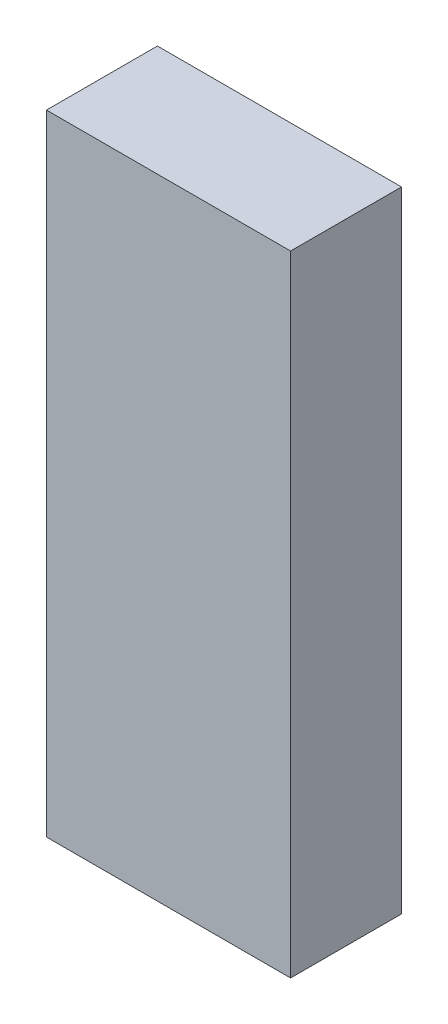
ISO-10303-21;
HEADER;
FILE_DESCRIPTION(('STEP AP214'),'2;1');
FILE_NAME('part.step','',(''),(''),'','','');
FILE_SCHEMA(('AUTOMOTIVE_DESIGN { 1 0 10303 214 1 1 1 1 }'));
ENDSEC;
DATA;
#1=APPLICATION_CONTEXT('core data for automotive mechanical design processes');
#2=APPLICATION_PROTOCOL_DEFINITION('international standard','automotive_design',2000,#1);
#3=PRODUCT_CONTEXT('',#1,'mechanical');
#4=PRODUCT('Part','Part','',(#3));
#5=PRODUCT_RELATED_PRODUCT_CATEGORY('part','',(#4));
#6=PRODUCT_DEFINITION_FORMATION('','',#4);
#7=PRODUCT_DEFINITION_CONTEXT('part definition',#1,'design');
#8=PRODUCT_DEFINITION('design','',#6,#7);
#9=PRODUCT_DEFINITION_SHAPE('','',#8);
#10=(LENGTH_UNIT() NAMED_UNIT(*) SI_UNIT(.MILLI.,.METRE.));
#11=(NAMED_UNIT(*) PLANE_ANGLE_UNIT() SI_UNIT($,.RADIAN.));
#12=(NAMED_UNIT(*) SI_UNIT($,.STERADIAN.) SOLID_ANGLE_UNIT());
#13=UNCERTAINTY_MEASURE_WITH_UNIT(LENGTH_MEASURE(1.E-05),#10,'distance_accuracy_value','');
#14=(GEOMETRIC_REPRESENTATION_CONTEXT(3) GLOBAL_UNCERTAINTY_ASSIGNED_CONTEXT((#13)) GLOBAL_UNIT_ASSIGNED_CONTEXT((#10,
#11,#12)) REPRESENTATION_CONTEXT('',''));
#15=CARTESIAN_POINT('',(0.,0.,0.));
#16=DIRECTION('',(0.,0.,1.));
#17=DIRECTION('',(1.,0.,0.));
#18=AXIS2_PLACEMENT_3D('',#15,#16,#17);
#19=CARTESIAN_POINT('',(-1.92499996,4.96499896,1.75));
#20=DIRECTION('',(0.,0.,1.));
#21=DIRECTION('',(1.,0.,0.));
#22=AXIS2_PLACEMENT_3D('',#19,#20,#21);
#23=PLANE('',#22);
#24=DIRECTION('',(0.,1.,0.));
#25=VECTOR('',#24,1.);
#26=CARTESIAN_POINT('',(1.92499996,4.96499896,1.75));
#27=LINE('',#26,#25);
#28=CARTESIAN_POINT('',(1.92499996,4.96499896,1.75));
#29=VERTEX_POINT('',#28);
#30=CARTESIAN_POINT('',(1.92499996,-4.96499896,1.75));
#31=VERTEX_POINT('',#30);
#32=EDGE_CURVE('E53',#29,#31,#27,.F.);
#33=ORIENTED_EDGE('',*,*,#32,.F.);
#34=DIRECTION('',(1.,0.,0.));
#35=VECTOR('',#34,1.);
#36=CARTESIAN_POINT('',(-1.92499996,4.96499896,1.75));
#37=LINE('',#36,#35);
#38=CARTESIAN_POINT('',(-1.92499996,4.96499896,1.75));
#39=VERTEX_POINT('',#38);
#40=EDGE_CURVE('E68',#39,#29,#37,.T.);
#41=ORIENTED_EDGE('',*,*,#40,.F.);
#42=DIRECTION('',(0.,1.,0.));
#43=VECTOR('',#42,1.);
#44=CARTESIAN_POINT('',(-1.92499996,-4.96499896,1.75));
#45=LINE('',#44,#43);
#46=CARTESIAN_POINT('',(-1.92499996,-4.96499896,1.75));
#47=VERTEX_POINT('',#46);
#48=EDGE_CURVE('E20',#47,#39,#45,.T.);
#49=ORIENTED_EDGE('',*,*,#48,.F.);
#50=DIRECTION('',(1.,0.,0.));
#51=VECTOR('',#50,1.);
#52=CARTESIAN_POINT('',(1.92499996,-4.96499896,1.75));
#53=LINE('',#52,#51);
#54=EDGE_CURVE('E58',#31,#47,#53,.F.);
#55=ORIENTED_EDGE('',*,*,#54,.F.);
#56=EDGE_LOOP('',(#33,#41,#49,#55));
#57=FACE_BOUND('',#56,.T.);
#58=ADVANCED_FACE('F17',(#57),#23,.T.);
#59=CARTESIAN_POINT('',(-1.92499996,-4.96499896,0.));
#60=DIRECTION('',(-1.,0.,0.));
#61=DIRECTION('',(0.,0.,1.));
#62=AXIS2_PLACEMENT_3D('',#59,#60,#61);
#63=PLANE('',#62);
#64=DIRECTION('',(0.,0.,1.));
#65=VECTOR('',#64,1.);
#66=CARTESIAN_POINT('',(-1.92499996,4.96499896,0.));
#67=LINE('',#66,#65);
#68=CARTESIAN_POINT('',(-1.92499996,4.96499896,0.));
#69=VERTEX_POINT('',#68);
#70=EDGE_CURVE('E79',#69,#39,#67,.T.);
#71=ORIENTED_EDGE('',*,*,#70,.F.);
#72=DIRECTION('',(0.,1.,0.));
#73=VECTOR('',#72,1.);
#74=CARTESIAN_POINT('',(-1.92499996,4.96499896,0.));
#75=LINE('',#74,#73);
#76=CARTESIAN_POINT('',(-1.92499996,-4.96499896,0.));
#77=VERTEX_POINT('',#76);
#78=EDGE_CURVE('E74',#69,#77,#75,.F.);
#79=ORIENTED_EDGE('',*,*,#78,.T.);
#80=DIRECTION('',(0.,0.,-1.));
#81=VECTOR('',#80,1.);
#82=CARTESIAN_POINT('',(-1.92499996,-4.96499896,0.));
#83=LINE('',#82,#81);
#84=EDGE_CURVE('E63',#47,#77,#83,.T.);
#85=ORIENTED_EDGE('',*,*,#84,.F.);
#86=ORIENTED_EDGE('',*,*,#48,.T.);
#87=EDGE_LOOP('',(#71,#79,#85,#86));
#88=FACE_BOUND('',#87,.T.);
#89=ADVANCED_FACE('F73',(#88),#63,.T.);
#90=CARTESIAN_POINT('',(1.92499996,-4.96499896,0.));
#91=DIRECTION('',(0.,-1.,0.));
#92=DIRECTION('',(0.,0.,-1.));
#93=AXIS2_PLACEMENT_3D('',#90,#91,#92);
#94=PLANE('',#93);
#95=ORIENTED_EDGE('',*,*,#84,.T.);
#96=DIRECTION('',(1.,0.,0.));
#97=VECTOR('',#96,1.);
#98=CARTESIAN_POINT('',(-1.92499996,-4.96499896,0.));
#99=LINE('',#98,#97);
#100=CARTESIAN_POINT('',(1.92499996,-4.96499896,0.));
#101=VERTEX_POINT('',#100);
#102=EDGE_CURVE('E84',#77,#101,#99,.T.);
#103=ORIENTED_EDGE('',*,*,#102,.T.);
#104=DIRECTION('',(0.,0.,-1.));
#105=VECTOR('',#104,1.);
#106=CARTESIAN_POINT('',(1.92499996,-4.96499896,0.));
#107=LINE('',#106,#105);
#108=EDGE_CURVE('E65',#31,#101,#107,.T.);
#109=ORIENTED_EDGE('',*,*,#108,.F.);
#110=ORIENTED_EDGE('',*,*,#54,.T.);
#111=EDGE_LOOP('',(#95,#103,#109,#110));
#112=FACE_BOUND('',#111,.T.);
#113=ADVANCED_FACE('F60',(#112),#94,.T.);
#114=CARTESIAN_POINT('',(1.92499996,4.96499896,0.));
#115=DIRECTION('',(1.,0.,0.));
#116=DIRECTION('',(0.,0.,-1.));
#117=AXIS2_PLACEMENT_3D('',#114,#115,#116);
#118=PLANE('',#117);
#119=ORIENTED_EDGE('',*,*,#108,.T.);
#120=DIRECTION('',(0.,1.,0.));
#121=VECTOR('',#120,1.);
#122=CARTESIAN_POINT('',(1.92499996,4.96499896,0.));
#123=LINE('',#122,#121);
#124=CARTESIAN_POINT('',(1.92499996,4.96499896,0.));
#125=VERTEX_POINT('',#124);
#126=EDGE_CURVE('E26',#101,#125,#123,.T.);
#127=ORIENTED_EDGE('',*,*,#126,.T.);
#128=DIRECTION('',(0.,0.,1.));
#129=VECTOR('',#128,1.);
#130=CARTESIAN_POINT('',(1.92499996,4.96499896,0.));
#131=LINE('',#130,#129);
#132=EDGE_CURVE('E34',#29,#125,#131,.F.);
#133=ORIENTED_EDGE('',*,*,#132,.F.);
#134=ORIENTED_EDGE('',*,*,#32,.T.);
#135=EDGE_LOOP('',(#119,#127,#133,#134));
#136=FACE_BOUND('',#135,.T.);
#137=ADVANCED_FACE('F88',(#136),#118,.T.);
#138=CARTESIAN_POINT('',(-1.92499996,4.96499896,0.));
#139=DIRECTION('',(0.,1.,0.));
#140=DIRECTION('',(0.,0.,1.));
#141=AXIS2_PLACEMENT_3D('',#138,#139,#140);
#142=PLANE('',#141);
#143=ORIENTED_EDGE('',*,*,#132,.T.);
#144=DIRECTION('',(1.,0.,0.));
#145=VECTOR('',#144,1.);
#146=CARTESIAN_POINT('',(-1.92499996,4.96499896,0.));
#147=LINE('',#146,#145);
#148=EDGE_CURVE('E11',#125,#69,#147,.F.);
#149=ORIENTED_EDGE('',*,*,#148,.T.);
#150=ORIENTED_EDGE('',*,*,#70,.T.);
#151=ORIENTED_EDGE('',*,*,#40,.T.);
#152=EDGE_LOOP('',(#143,#149,#150,#151));
#153=FACE_BOUND('',#152,.T.);
#154=ADVANCED_FACE('F91',(#153),#142,.T.);
#155=CARTESIAN_POINT('',(-1.92499996,4.96499896,0.));
#156=DIRECTION('',(0.,0.,1.));
#157=DIRECTION('',(1.,0.,0.));
#158=AXIS2_PLACEMENT_3D('',#155,#156,#157);
#159=PLANE('',#158);
#160=ORIENTED_EDGE('',*,*,#126,.F.);
#161=ORIENTED_EDGE('',*,*,#102,.F.);
#162=ORIENTED_EDGE('',*,*,#78,.F.);
#163=ORIENTED_EDGE('',*,*,#148,.F.);
#164=EDGE_LOOP('',(#160,#161,#162,#163));
#165=FACE_BOUND('',#164,.T.);
#166=ADVANCED_FACE('F90',(#165),#159,.F.);
#167=CLOSED_SHELL('',(#58,#89,#113,#137,#154,#166));
#168=MANIFOLD_SOLID_BREP('B1',#167);
#169=ADVANCED_BREP_SHAPE_REPRESENTATION('',(#18,#168),#14);
#170=SHAPE_DEFINITION_REPRESENTATION(#9,#169);
ENDSEC;
END-ISO-10303-21;
